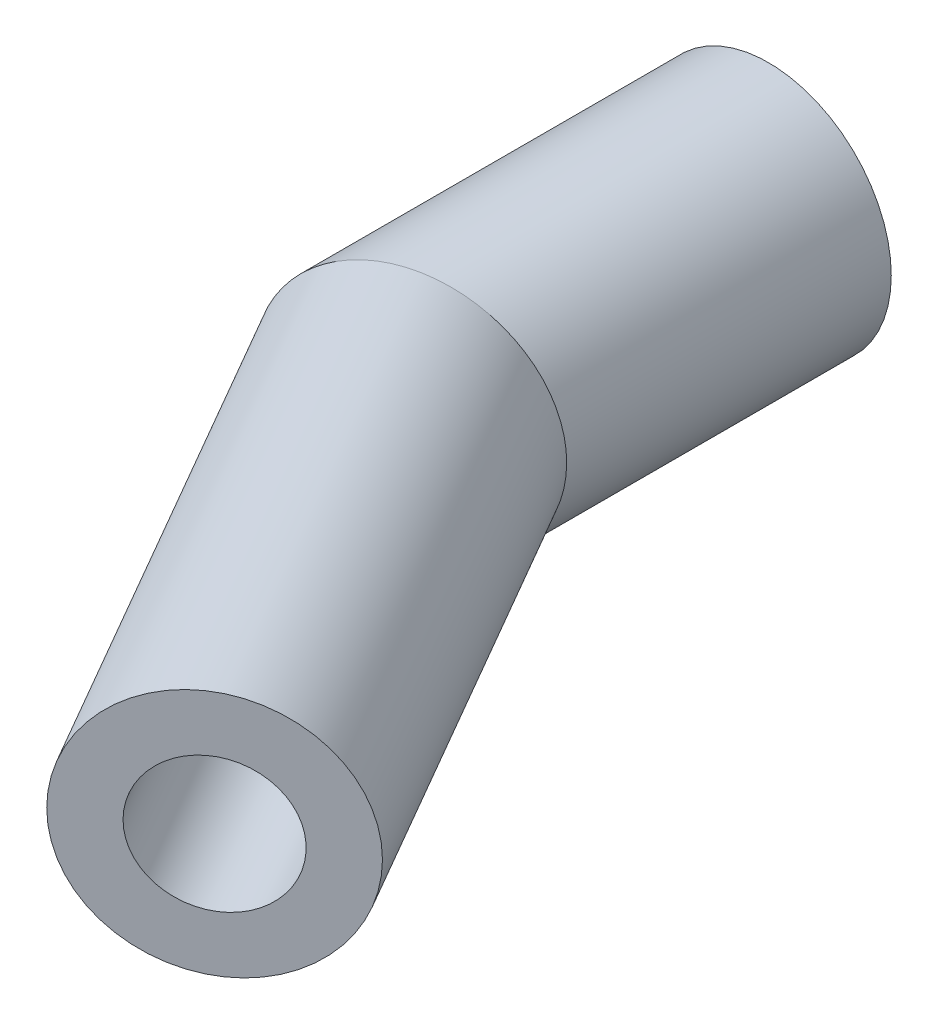
ISO-10303-21;
HEADER;
FILE_DESCRIPTION(('STEP AP214'),'2;1');
FILE_NAME('part.step','',(''),(''),'','','');
FILE_SCHEMA(('AUTOMOTIVE_DESIGN { 1 0 10303 214 1 1 1 1 }'));
ENDSEC;
DATA;
#1=APPLICATION_CONTEXT('core data for automotive mechanical design processes');
#2=APPLICATION_PROTOCOL_DEFINITION('international standard','automotive_design',2000,#1);
#3=PRODUCT_CONTEXT('',#1,'mechanical');
#4=PRODUCT('Part','Part','',(#3));
#5=PRODUCT_RELATED_PRODUCT_CATEGORY('part','',(#4));
#6=PRODUCT_DEFINITION_FORMATION('','',#4);
#7=PRODUCT_DEFINITION_CONTEXT('part definition',#1,'design');
#8=PRODUCT_DEFINITION('design','',#6,#7);
#9=PRODUCT_DEFINITION_SHAPE('','',#8);
#10=(LENGTH_UNIT() NAMED_UNIT(*) SI_UNIT(.MILLI.,.METRE.));
#11=(NAMED_UNIT(*) PLANE_ANGLE_UNIT() SI_UNIT($,.RADIAN.));
#12=(NAMED_UNIT(*) SI_UNIT($,.STERADIAN.) SOLID_ANGLE_UNIT());
#13=UNCERTAINTY_MEASURE_WITH_UNIT(LENGTH_MEASURE(1.E-05),#10,'distance_accuracy_value','');
#14=(GEOMETRIC_REPRESENTATION_CONTEXT(3) GLOBAL_UNCERTAINTY_ASSIGNED_CONTEXT((#13)) GLOBAL_UNIT_ASSIGNED_CONTEXT((#10,
#11,#12)) REPRESENTATION_CONTEXT('',''));
#15=CARTESIAN_POINT('',(0.,0.,0.));
#16=DIRECTION('',(0.,0.,1.));
#17=DIRECTION('',(1.,0.,0.));
#18=AXIS2_PLACEMENT_3D('',#15,#16,#17);
#19=CARTESIAN_POINT('',(19.0500000000004,0.,58.3955678841869));
#20=DIRECTION('',(-0.50000000000001,0.,-0.866025403784433));
#21=DIRECTION('',(-0.866025403784433,0.,0.50000000000001));
#22=AXIS2_PLACEMENT_3D('',#19,#20,#21);
#23=PLANE('',#22);
#24=CARTESIAN_POINT('',(19.0500000000004,0.,58.3955678841869));
#25=DIRECTION('',(-0.50000000000001,0.,-0.866025403784433));
#26=DIRECTION('',(-0.866025403784433,0.,0.50000000000001));
#27=AXIS2_PLACEMENT_3D('',#24,#25,#26);
#28=CIRCLE('',#27,4.7625);
#29=CARTESIAN_POINT('',(14.925554014477,0.,60.776817884187));
#30=VERTEX_POINT('',#29);
#31=EDGE_CURVE('E67',#30,#30,#28,.T.);
#32=ORIENTED_EDGE('',*,*,#31,.T.);
#33=EDGE_LOOP('',(#32));
#34=FACE_BOUND('',#33,.T.);
#35=CARTESIAN_POINT('',(19.0500000000004,0.,58.3955678841869));
#36=DIRECTION('',(-0.50000000000001,0.,-0.866025403784433));
#37=DIRECTION('',(-0.866025403784433,0.,0.50000000000001));
#38=AXIS2_PLACEMENT_3D('',#35,#36,#37);
#39=CIRCLE('',#38,8.73125);
#40=CARTESIAN_POINT('',(11.4885156932076,0.,62.761192884187));
#41=VERTEX_POINT('',#40);
#42=EDGE_CURVE('E51',#41,#41,#39,.T.);
#43=ORIENTED_EDGE('',*,*,#42,.F.);
#44=EDGE_LOOP('',(#43));
#45=FACE_BOUND('',#44,.T.);
#46=ADVANCED_FACE('F48',(#34,#45),#23,.F.);
#47=CARTESIAN_POINT('',(0.,0.,0.));
#48=DIRECTION('',(0.,0.,-1.));
#49=DIRECTION('',(-1.,0.,0.));
#50=AXIS2_PLACEMENT_3D('',#47,#48,#49);
#51=PLANE('',#50);
#52=CARTESIAN_POINT('',(0.,0.,0.));
#53=DIRECTION('',(0.,0.,-1.));
#54=DIRECTION('',(-1.,0.,0.));
#55=AXIS2_PLACEMENT_3D('',#52,#53,#54);
#56=CIRCLE('',#55,4.7625);
#57=CARTESIAN_POINT('',(-4.7625,0.,0.));
#58=VERTEX_POINT('',#57);
#59=EDGE_CURVE('E61',#58,#58,#56,.T.);
#60=ORIENTED_EDGE('',*,*,#59,.F.);
#61=EDGE_LOOP('',(#60));
#62=FACE_BOUND('',#61,.T.);
#63=CARTESIAN_POINT('',(0.,0.,0.));
#64=DIRECTION('',(0.,0.,-1.));
#65=DIRECTION('',(-1.,0.,0.));
#66=AXIS2_PLACEMENT_3D('',#63,#64,#65);
#67=CIRCLE('',#66,8.73125);
#68=CARTESIAN_POINT('',(-8.73125,0.,0.));
#69=VERTEX_POINT('',#68);
#70=EDGE_CURVE('E55',#69,#69,#67,.T.);
#71=ORIENTED_EDGE('',*,*,#70,.T.);
#72=EDGE_LOOP('',(#71));
#73=FACE_BOUND('',#72,.T.);
#74=ADVANCED_FACE('F86',(#62,#73),#51,.T.);
#75=CARTESIAN_POINT('',(-1.33674226252789,0.,23.0846944846772));
#76=DIRECTION('',(0.50000000000001,0.,0.866025403784433));
#77=DIRECTION('',(0.866025403784433,0.,-0.50000000000001));
#78=AXIS2_PLACEMENT_3D('',#75,#76,#77);
#79=CYLINDRICAL_SURFACE('',#78,8.73125);
#80=CARTESIAN_POINT('',(0.,0.,25.4));
#81=DIRECTION('',(0.258819045102527,0.,0.965925826289067));
#82=DIRECTION('',(-0.965925826289067,0.,0.258819045102527));
#83=AXIS2_PLACEMENT_3D('',#80,#81,#82);
#84=ELLIPSE('',#83,9.03925515020555,8.73125);
#85=CARTESIAN_POINT('',(-8.73125,0.,27.7395313864143));
#86=VERTEX_POINT('',#85);
#87=EDGE_CURVE('E11',#86,#86,#84,.T.);
#88=ORIENTED_EDGE('',*,*,#87,.T.);
#89=EDGE_LOOP('',(#88));
#90=FACE_BOUND('',#89,.T.);
#91=ORIENTED_EDGE('',*,*,#42,.T.);
#92=EDGE_LOOP('',(#91));
#93=FACE_BOUND('',#92,.T.);
#94=ADVANCED_FACE('F89',(#90,#93),#79,.T.);
#95=CARTESIAN_POINT('',(0.,0.,0.));
#96=DIRECTION('',(0.,0.,1.));
#97=DIRECTION('',(1.,0.,0.));
#98=AXIS2_PLACEMENT_3D('',#95,#96,#97);
#99=CYLINDRICAL_SURFACE('',#98,8.73125);
#100=ORIENTED_EDGE('',*,*,#70,.F.);
#101=EDGE_LOOP('',(#100));
#102=FACE_BOUND('',#101,.T.);
#103=ORIENTED_EDGE('',*,*,#87,.F.);
#104=EDGE_LOOP('',(#103));
#105=FACE_BOUND('',#104,.T.);
#106=ADVANCED_FACE('F82',(#102,#105),#99,.T.);
#107=CARTESIAN_POINT('',(0.,0.,-1.));
#108=DIRECTION('',(0.,0.,1.));
#109=DIRECTION('',(1.,0.,0.));
#110=AXIS2_PLACEMENT_3D('',#107,#108,#109);
#111=CYLINDRICAL_SURFACE('',#110,4.7625);
#112=CARTESIAN_POINT('',(0.,0.,25.4));
#113=DIRECTION('',(0.258819045102526,0.,0.965925826289067));
#114=DIRECTION('',(-0.965925826289067,0.,0.258819045102526));
#115=AXIS2_PLACEMENT_3D('',#112,#113,#114);
#116=ELLIPSE('',#115,4.93050280920303,4.7625);
#117=CARTESIAN_POINT('',(-4.7625,0.,26.6761080289533));
#118=VERTEX_POINT('',#117);
#119=EDGE_CURVE('E64',#118,#118,#116,.T.);
#120=ORIENTED_EDGE('',*,*,#119,.T.);
#121=EDGE_LOOP('',(#120));
#122=FACE_BOUND('',#121,.T.);
#123=ORIENTED_EDGE('',*,*,#59,.T.);
#124=EDGE_LOOP('',(#123));
#125=FACE_BOUND('',#124,.T.);
#126=ADVANCED_FACE('F76',(#122,#125),#111,.F.);
#127=CARTESIAN_POINT('',(-0.751859415924306,0.,24.0977412914701));
#128=DIRECTION('',(0.50000000000001,0.,0.866025403784433));
#129=DIRECTION('',(0.866025403784433,0.,-0.50000000000001));
#130=AXIS2_PLACEMENT_3D('',#127,#128,#129);
#131=CYLINDRICAL_SURFACE('',#130,4.7625);
#132=ORIENTED_EDGE('',*,*,#31,.F.);
#133=EDGE_LOOP('',(#132));
#134=FACE_BOUND('',#133,.T.);
#135=ORIENTED_EDGE('',*,*,#119,.F.);
#136=EDGE_LOOP('',(#135));
#137=FACE_BOUND('',#136,.T.);
#138=ADVANCED_FACE('F73',(#134,#137),#131,.F.);
#139=CLOSED_SHELL('',(#46,#74,#94,#106,#126,#138));
#140=MANIFOLD_SOLID_BREP('B2',#139);
#141=ADVANCED_BREP_SHAPE_REPRESENTATION('',(#18,#140),#14);
#142=SHAPE_DEFINITION_REPRESENTATION(#9,#141);
ENDSEC;
END-ISO-10303-21;
